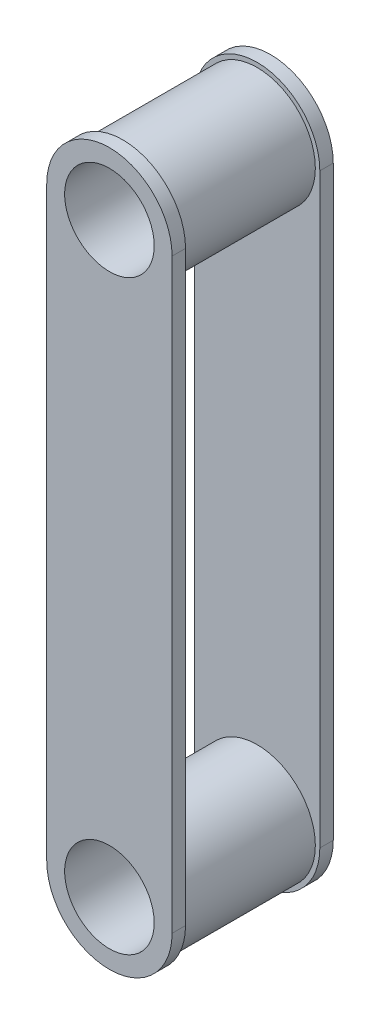
ISO-10303-21;
HEADER;
FILE_DESCRIPTION(('STEP AP214'),'2;1');
FILE_NAME('part.step','',(''),(''),'','','');
FILE_SCHEMA(('AUTOMOTIVE_DESIGN { 1 0 10303 214 1 1 1 1 }'));
ENDSEC;
DATA;
#1=APPLICATION_CONTEXT('core data for automotive mechanical design processes');
#2=APPLICATION_PROTOCOL_DEFINITION('international standard','automotive_design',2000,#1);
#3=PRODUCT_CONTEXT('',#1,'mechanical');
#4=PRODUCT('Part','Part','',(#3));
#5=PRODUCT_RELATED_PRODUCT_CATEGORY('part','',(#4));
#6=PRODUCT_DEFINITION_FORMATION('','',#4);
#7=PRODUCT_DEFINITION_CONTEXT('part definition',#1,'design');
#8=PRODUCT_DEFINITION('design','',#6,#7);
#9=PRODUCT_DEFINITION_SHAPE('','',#8);
#10=(LENGTH_UNIT() NAMED_UNIT(*) SI_UNIT(.MILLI.,.METRE.));
#11=(NAMED_UNIT(*) PLANE_ANGLE_UNIT() SI_UNIT($,.RADIAN.));
#12=(NAMED_UNIT(*) SI_UNIT($,.STERADIAN.) SOLID_ANGLE_UNIT());
#13=UNCERTAINTY_MEASURE_WITH_UNIT(LENGTH_MEASURE(1.E-05),#10,'distance_accuracy_value','');
#14=(GEOMETRIC_REPRESENTATION_CONTEXT(3) GLOBAL_UNCERTAINTY_ASSIGNED_CONTEXT((#13)) GLOBAL_UNIT_ASSIGNED_CONTEXT((#10,
#11,#12)) REPRESENTATION_CONTEXT('',''));
#15=CARTESIAN_POINT('',(0.,0.,0.));
#16=DIRECTION('',(0.,0.,1.));
#17=DIRECTION('',(1.,0.,0.));
#18=AXIS2_PLACEMENT_3D('',#15,#16,#17);
#19=CARTESIAN_POINT('',(-4.40536496171262E-12,655.,89.9999999999981));
#20=DIRECTION('',(0.,0.,-1.));
#21=DIRECTION('',(0.,-1.,0.));
#22=AXIS2_PLACEMENT_3D('',#19,#20,#21);
#23=PLANE('',#22);
#24=CARTESIAN_POINT('',(-4.40536496171262E-12,655.,89.9999999999981));
#25=DIRECTION('',(0.,0.,1.));
#26=DIRECTION('',(-1.,0.,0.));
#27=AXIS2_PLACEMENT_3D('',#24,#25,#26);
#28=CIRCLE('',#27,50.);
#29=CARTESIAN_POINT('',(49.9999999999956,655.,89.9999999999981));
#30=VERTEX_POINT('',#29);
#31=EDGE_CURVE('E27',#30,#30,#28,.T.);
#32=ORIENTED_EDGE('',*,*,#31,.F.);
#33=EDGE_LOOP('',(#32));
#34=FACE_BOUND('',#33,.T.);
#35=CARTESIAN_POINT('',(-3.69482222595252E-12,-4.2632564145606E-13,89.9999999999981));
#36=DIRECTION('',(0.,0.,-1.));
#37=DIRECTION('',(-1.,0.,0.));
#38=AXIS2_PLACEMENT_3D('',#35,#36,#37);
#39=CIRCLE('',#38,50.);
#40=CARTESIAN_POINT('',(49.9999999999963,-2.8421709430404E-13,89.9999999999981));
#41=VERTEX_POINT('',#40);
#42=EDGE_CURVE('E71',#41,#41,#39,.T.);
#43=ORIENTED_EDGE('',*,*,#42,.T.);
#44=EDGE_LOOP('',(#43));
#45=FACE_BOUND('',#44,.T.);
#46=CARTESIAN_POINT('',(-4.40536496171262E-12,655.,89.9999999999981));
#47=DIRECTION('',(0.,0.,-1.));
#48=DIRECTION('',(-1.,0.,0.));
#49=AXIS2_PLACEMENT_3D('',#46,#47,#48);
#50=CIRCLE('',#49,70.);
#51=CARTESIAN_POINT('',(-70.0000000000044,655.,89.9999999999981));
#52=VERTEX_POINT('',#51);
#53=CARTESIAN_POINT('',(69.9999999999956,655.,89.9999999999981));
#54=VERTEX_POINT('',#53);
#55=EDGE_CURVE('E175',#52,#54,#50,.T.);
#56=ORIENTED_EDGE('',*,*,#55,.F.);
#57=DIRECTION('',(0.,-1.,0.));
#58=VECTOR('',#57,1.);
#59=CARTESIAN_POINT('',(-70.0000000000043,585.,89.9999999999981));
#60=LINE('',#59,#58);
#61=CARTESIAN_POINT('',(-70.0000000000037,-5.6843418860808E-13,89.9999999999981));
#62=VERTEX_POINT('',#61);
#63=EDGE_CURVE('E61',#52,#62,#60,.T.);
#64=ORIENTED_EDGE('',*,*,#63,.T.);
#65=CARTESIAN_POINT('',(-3.69482222595252E-12,-4.2632564145606E-13,89.9999999999981));
#66=DIRECTION('',(0.,0.,1.));
#67=DIRECTION('',(-1.,0.,0.));
#68=AXIS2_PLACEMENT_3D('',#65,#66,#67);
#69=CIRCLE('',#68,70.);
#70=CARTESIAN_POINT('',(69.9999999999963,-2.8421709430404E-13,89.9999999999981));
#71=VERTEX_POINT('',#70);
#72=EDGE_CURVE('E200',#62,#71,#69,.T.);
#73=ORIENTED_EDGE('',*,*,#72,.T.);
#74=DIRECTION('',(0.,-1.,0.));
#75=VECTOR('',#74,1.);
#76=CARTESIAN_POINT('',(69.9999999999957,565.,89.9999999999981));
#77=LINE('',#76,#75);
#78=EDGE_CURVE('E222',#54,#71,#77,.T.);
#79=ORIENTED_EDGE('',*,*,#78,.F.);
#80=EDGE_LOOP('',(#56,#64,#73,#79));
#81=FACE_BOUND('',#80,.T.);
#82=ADVANCED_FACE('F16',(#34,#45,#81),#23,.F.);
#83=CARTESIAN_POINT('',(-4.40536496171262E-12,655.,-90.0000000000019));
#84=DIRECTION('',(0.,0.,-1.));
#85=DIRECTION('',(0.,-1.,0.));
#86=AXIS2_PLACEMENT_3D('',#83,#84,#85);
#87=PLANE('',#86);
#88=CARTESIAN_POINT('',(-4.40536496171262E-12,655.,-90.0000000000019));
#89=DIRECTION('',(0.,0.,1.));
#90=DIRECTION('',(-1.,0.,0.));
#91=AXIS2_PLACEMENT_3D('',#88,#89,#90);
#92=CIRCLE('',#91,50.);
#93=CARTESIAN_POINT('',(49.9999999999956,655.,-90.0000000000019));
#94=VERTEX_POINT('',#93);
#95=EDGE_CURVE('E211',#94,#94,#92,.T.);
#96=ORIENTED_EDGE('',*,*,#95,.T.);
#97=EDGE_LOOP('',(#96));
#98=FACE_BOUND('',#97,.T.);
#99=CARTESIAN_POINT('',(-3.69482222595252E-12,-4.2632564145606E-13,-90.0000000000019));
#100=DIRECTION('',(0.,0.,-1.));
#101=DIRECTION('',(-1.,0.,0.));
#102=AXIS2_PLACEMENT_3D('',#99,#100,#101);
#103=CIRCLE('',#102,50.);
#104=CARTESIAN_POINT('',(49.9999999999963,-2.8421709430404E-13,-90.0000000000019));
#105=VERTEX_POINT('',#104);
#106=EDGE_CURVE('E184',#105,#105,#103,.T.);
#107=ORIENTED_EDGE('',*,*,#106,.F.);
#108=EDGE_LOOP('',(#107));
#109=FACE_BOUND('',#108,.T.);
#110=CARTESIAN_POINT('',(-4.40536496171262E-12,655.,-90.0000000000019));
#111=DIRECTION('',(0.,0.,-1.));
#112=DIRECTION('',(-1.,0.,0.));
#113=AXIS2_PLACEMENT_3D('',#110,#111,#112);
#114=CIRCLE('',#113,70.);
#115=CARTESIAN_POINT('',(-70.0000000000044,655.,-90.0000000000019));
#116=VERTEX_POINT('',#115);
#117=CARTESIAN_POINT('',(69.9999999999956,655.,-90.0000000000019));
#118=VERTEX_POINT('',#117);
#119=EDGE_CURVE('E11',#116,#118,#114,.T.);
#120=ORIENTED_EDGE('',*,*,#119,.T.);
#121=DIRECTION('',(0.,-1.,0.));
#122=VECTOR('',#121,1.);
#123=CARTESIAN_POINT('',(69.9999999999956,655.,-90.0000000000019));
#124=LINE('',#123,#122);
#125=CARTESIAN_POINT('',(69.9999999999963,-2.8421709430404E-13,-90.0000000000019));
#126=VERTEX_POINT('',#125);
#127=EDGE_CURVE('E182',#118,#126,#124,.T.);
#128=ORIENTED_EDGE('',*,*,#127,.T.);
#129=CARTESIAN_POINT('',(-3.69482222595252E-12,-4.2632564145606E-13,-90.0000000000019));
#130=DIRECTION('',(0.,0.,1.));
#131=DIRECTION('',(-1.,0.,0.));
#132=AXIS2_PLACEMENT_3D('',#129,#130,#131);
#133=CIRCLE('',#132,70.);
#134=CARTESIAN_POINT('',(-70.0000000000037,-5.6843418860808E-13,-90.0000000000019));
#135=VERTEX_POINT('',#134);
#136=EDGE_CURVE('E148',#135,#126,#133,.T.);
#137=ORIENTED_EDGE('',*,*,#136,.F.);
#138=DIRECTION('',(0.,1.,0.));
#139=VECTOR('',#138,1.);
#140=CARTESIAN_POINT('',(-70.0000000000038,70.,-90.0000000000019));
#141=LINE('',#140,#139);
#142=EDGE_CURVE('E145',#135,#116,#141,.T.);
#143=ORIENTED_EDGE('',*,*,#142,.T.);
#144=EDGE_LOOP('',(#120,#128,#137,#143));
#145=FACE_BOUND('',#144,.T.);
#146=ADVANCED_FACE('F307',(#98,#109,#145),#87,.T.);
#147=CARTESIAN_POINT('',(-4.40536496171262E-12,655.,89.9999999999981));
#148=DIRECTION('',(0.,0.,-1.));
#149=DIRECTION('',(-1.,0.,0.));
#150=AXIS2_PLACEMENT_3D('',#147,#148,#149);
#151=CYLINDRICAL_SURFACE('',#150,70.);
#152=CARTESIAN_POINT('',(-4.40536496171262E-12,655.,-75.0000000000019));
#153=DIRECTION('',(0.,0.,-1.));
#154=DIRECTION('',(-1.,0.,0.));
#155=AXIS2_PLACEMENT_3D('',#152,#153,#154);
#156=CIRCLE('',#155,70.);
#157=CARTESIAN_POINT('',(-70.0000000000044,655.,-75.0000000000019));
#158=VERTEX_POINT('',#157);
#159=CARTESIAN_POINT('',(69.9999999999956,655.,-75.0000000000019));
#160=VERTEX_POINT('',#159);
#161=EDGE_CURVE('E161',#158,#160,#156,.T.);
#162=ORIENTED_EDGE('',*,*,#161,.T.);
#163=DIRECTION('',(0.,0.,-1.));
#164=VECTOR('',#163,1.);
#165=CARTESIAN_POINT('',(69.9999999999956,655.,89.9999999999981));
#166=LINE('',#165,#164);
#167=EDGE_CURVE('E177',#160,#118,#166,.T.);
#168=ORIENTED_EDGE('',*,*,#167,.T.);
#169=ORIENTED_EDGE('',*,*,#119,.F.);
#170=DIRECTION('',(0.,0.,-1.));
#171=VECTOR('',#170,1.);
#172=CARTESIAN_POINT('',(-70.0000000000044,655.,89.9999999999981));
#173=LINE('',#172,#171);
#174=EDGE_CURVE('E185',#158,#116,#173,.T.);
#175=ORIENTED_EDGE('',*,*,#174,.F.);
#176=EDGE_LOOP('',(#162,#168,#169,#175));
#177=FACE_BOUND('',#176,.T.);
#178=ADVANCED_FACE('F310',(#177),#151,.T.);
#179=CARTESIAN_POINT('',(-4.40536496171262E-12,655.,89.9999999999981));
#180=DIRECTION('',(0.,0.,-1.));
#181=DIRECTION('',(-1.,0.,0.));
#182=AXIS2_PLACEMENT_3D('',#179,#180,#181);
#183=CYLINDRICAL_SURFACE('',#182,50.);
#184=ORIENTED_EDGE('',*,*,#95,.F.);
#185=DIRECTION('',(0.,0.,1.));
#186=VECTOR('',#185,1.);
#187=CARTESIAN_POINT('',(49.9999999999956,655.,89.9999999999981));
#188=LINE('',#187,#186);
#189=EDGE_CURVE('E215',#94,#30,#188,.T.);
#190=ORIENTED_EDGE('',*,*,#189,.T.);
#191=ORIENTED_EDGE('',*,*,#31,.T.);
#192=ORIENTED_EDGE('',*,*,#189,.F.);
#193=EDGE_LOOP('',(#184,#190,#191,#192));
#194=FACE_BOUND('',#193,.T.);
#195=ADVANCED_FACE('F340',(#194),#183,.F.);
#196=CARTESIAN_POINT('',(-70.0000000000044,655.,-90.0000000000019));
#197=DIRECTION('',(-1.,0.,0.));
#198=DIRECTION('',(0.,1.,0.));
#199=AXIS2_PLACEMENT_3D('',#196,#197,#198);
#200=PLANE('',#199);
#201=DIRECTION('',(0.,-1.,0.));
#202=VECTOR('',#201,1.);
#203=CARTESIAN_POINT('',(-70.0000000000044,655.,74.9999999999981));
#204=LINE('',#203,#202);
#205=CARTESIAN_POINT('',(-70.0000000000044,655.,74.9999999999981));
#206=VERTEX_POINT('',#205);
#207=CARTESIAN_POINT('',(-70.0000000000037,-5.6843418860808E-13,74.9999999999981));
#208=VERTEX_POINT('',#207);
#209=EDGE_CURVE('E149',#206,#208,#204,.T.);
#210=ORIENTED_EDGE('',*,*,#209,.T.);
#211=DIRECTION('',(0.,0.,-1.));
#212=VECTOR('',#211,1.);
#213=CARTESIAN_POINT('',(-70.0000000000037,-5.6843418860808E-13,89.9999999999981));
#214=LINE('',#213,#212);
#215=EDGE_CURVE('E208',#62,#208,#214,.T.);
#216=ORIENTED_EDGE('',*,*,#215,.F.);
#217=ORIENTED_EDGE('',*,*,#63,.F.);
#218=DIRECTION('',(0.,0.,-1.));
#219=VECTOR('',#218,1.);
#220=CARTESIAN_POINT('',(-70.0000000000044,655.,89.9999999999981));
#221=LINE('',#220,#219);
#222=EDGE_CURVE('E172',#52,#206,#221,.T.);
#223=ORIENTED_EDGE('',*,*,#222,.T.);
#224=EDGE_LOOP('',(#210,#216,#217,#223));
#225=FACE_BOUND('',#224,.T.);
#226=ADVANCED_FACE('F293',(#225),#200,.T.);
#227=CARTESIAN_POINT('',(-3.69482222595252E-12,-4.2632564145606E-13,89.9999999999981));
#228=DIRECTION('',(0.,0.,1.));
#229=DIRECTION('',(-1.,0.,0.));
#230=AXIS2_PLACEMENT_3D('',#227,#228,#229);
#231=CYLINDRICAL_SURFACE('',#230,70.);
#232=CARTESIAN_POINT('',(-3.69482222595252E-12,-4.2632564145606E-13,74.9999999999981));
#233=DIRECTION('',(0.,0.,1.));
#234=DIRECTION('',(-1.,0.,0.));
#235=AXIS2_PLACEMENT_3D('',#232,#233,#234);
#236=CIRCLE('',#235,70.);
#237=CARTESIAN_POINT('',(69.9999999999963,-2.8421709430404E-13,74.9999999999981));
#238=VERTEX_POINT('',#237);
#239=EDGE_CURVE('E238',#208,#238,#236,.T.);
#240=ORIENTED_EDGE('',*,*,#239,.T.);
#241=DIRECTION('',(0.,0.,-1.));
#242=VECTOR('',#241,1.);
#243=CARTESIAN_POINT('',(69.9999999999963,-2.8421709430404E-13,89.9999999999981));
#244=LINE('',#243,#242);
#245=EDGE_CURVE('E176',#71,#238,#244,.T.);
#246=ORIENTED_EDGE('',*,*,#245,.F.);
#247=ORIENTED_EDGE('',*,*,#72,.F.);
#248=ORIENTED_EDGE('',*,*,#215,.T.);
#249=EDGE_LOOP('',(#240,#246,#247,#248));
#250=FACE_BOUND('',#249,.T.);
#251=ADVANCED_FACE('F296',(#250),#231,.T.);
#252=CARTESIAN_POINT('',(-3.69482222595252E-12,-4.2632564145606E-13,89.9999999999981));
#253=DIRECTION('',(0.,0.,1.));
#254=DIRECTION('',(-1.,0.,0.));
#255=AXIS2_PLACEMENT_3D('',#252,#253,#254);
#256=CYLINDRICAL_SURFACE('',#255,50.);
#257=ORIENTED_EDGE('',*,*,#106,.T.);
#258=DIRECTION('',(0.,0.,1.));
#259=VECTOR('',#258,1.);
#260=CARTESIAN_POINT('',(49.9999999999963,-3.30058741119386E-13,89.9999999999981));
#261=LINE('',#260,#259);
#262=EDGE_CURVE('E191',#105,#41,#261,.T.);
#263=ORIENTED_EDGE('',*,*,#262,.T.);
#264=ORIENTED_EDGE('',*,*,#42,.F.);
#265=ORIENTED_EDGE('',*,*,#262,.F.);
#266=EDGE_LOOP('',(#257,#263,#264,#265));
#267=FACE_BOUND('',#266,.T.);
#268=ADVANCED_FACE('F449',(#267),#256,.F.);
#269=CARTESIAN_POINT('',(-70.0000000000044,655.,-90.0000000000019));
#270=DIRECTION('',(-1.,0.,0.));
#271=DIRECTION('',(0.,1.,0.));
#272=AXIS2_PLACEMENT_3D('',#269,#270,#271);
#273=PLANE('',#272);
#274=DIRECTION('',(0.,1.,0.));
#275=VECTOR('',#274,1.);
#276=CARTESIAN_POINT('',(-70.0000000000044,655.,-75.0000000000019));
#277=LINE('',#276,#275);
#278=CARTESIAN_POINT('',(-70.0000000000037,-5.6843418860808E-13,-75.0000000000019));
#279=VERTEX_POINT('',#278);
#280=EDGE_CURVE('E142',#279,#158,#277,.T.);
#281=ORIENTED_EDGE('',*,*,#280,.T.);
#282=ORIENTED_EDGE('',*,*,#174,.T.);
#283=ORIENTED_EDGE('',*,*,#142,.F.);
#284=DIRECTION('',(0.,0.,-1.));
#285=VECTOR('',#284,1.);
#286=CARTESIAN_POINT('',(-70.0000000000037,-5.6843418860808E-13,89.9999999999981));
#287=LINE('',#286,#285);
#288=EDGE_CURVE('E138',#279,#135,#287,.T.);
#289=ORIENTED_EDGE('',*,*,#288,.F.);
#290=EDGE_LOOP('',(#281,#282,#283,#289));
#291=FACE_BOUND('',#290,.T.);
#292=ADVANCED_FACE('F139',(#291),#273,.T.);
#293=CARTESIAN_POINT('',(-4.40536496171262E-12,655.,89.9999999999981));
#294=DIRECTION('',(0.,0.,-1.));
#295=DIRECTION('',(-1.,0.,0.));
#296=AXIS2_PLACEMENT_3D('',#293,#294,#295);
#297=CYLINDRICAL_SURFACE('',#296,70.);
#298=CARTESIAN_POINT('',(-4.40536496171262E-12,655.,74.9999999999981));
#299=DIRECTION('',(0.,0.,1.));
#300=DIRECTION('',(-1.,0.,0.));
#301=AXIS2_PLACEMENT_3D('',#298,#299,#300);
#302=CIRCLE('',#301,70.);
#303=CARTESIAN_POINT('',(69.9999999999956,655.,74.9999999999981));
#304=VERTEX_POINT('',#303);
#305=EDGE_CURVE('E189',#304,#206,#302,.T.);
#306=ORIENTED_EDGE('',*,*,#305,.T.);
#307=ORIENTED_EDGE('',*,*,#222,.F.);
#308=ORIENTED_EDGE('',*,*,#55,.T.);
#309=DIRECTION('',(0.,0.,-1.));
#310=VECTOR('',#309,1.);
#311=CARTESIAN_POINT('',(69.9999999999956,655.,89.9999999999981));
#312=LINE('',#311,#310);
#313=EDGE_CURVE('E181',#54,#304,#312,.T.);
#314=ORIENTED_EDGE('',*,*,#313,.T.);
#315=EDGE_LOOP('',(#306,#307,#308,#314));
#316=FACE_BOUND('',#315,.T.);
#317=ADVANCED_FACE('F275',(#316),#297,.T.);
#318=CARTESIAN_POINT('',(69.9999999999957,565.,-90.0000000000019));
#319=DIRECTION('',(1.,0.,0.));
#320=DIRECTION('',(0.,1.,0.));
#321=AXIS2_PLACEMENT_3D('',#318,#319,#320);
#322=PLANE('',#321);
#323=DIRECTION('',(0.,1.,0.));
#324=VECTOR('',#323,1.);
#325=CARTESIAN_POINT('',(69.9999999999957,610.,74.9999999999981));
#326=LINE('',#325,#324);
#327=EDGE_CURVE('E218',#238,#304,#326,.T.);
#328=ORIENTED_EDGE('',*,*,#327,.T.);
#329=ORIENTED_EDGE('',*,*,#313,.F.);
#330=ORIENTED_EDGE('',*,*,#78,.T.);
#331=ORIENTED_EDGE('',*,*,#245,.T.);
#332=EDGE_LOOP('',(#328,#329,#330,#331));
#333=FACE_BOUND('',#332,.T.);
#334=ADVANCED_FACE('F18',(#333),#322,.T.);
#335=CARTESIAN_POINT('',(69.9999999999957,565.,-90.0000000000019));
#336=DIRECTION('',(1.,0.,0.));
#337=DIRECTION('',(0.,1.,0.));
#338=AXIS2_PLACEMENT_3D('',#335,#336,#337);
#339=PLANE('',#338);
#340=DIRECTION('',(0.,-1.,0.));
#341=VECTOR('',#340,1.);
#342=CARTESIAN_POINT('',(69.9999999999957,610.,-75.0000000000019));
#343=LINE('',#342,#341);
#344=CARTESIAN_POINT('',(69.9999999999963,-2.8421709430404E-13,-75.0000000000019));
#345=VERTEX_POINT('',#344);
#346=EDGE_CURVE('E157',#160,#345,#343,.T.);
#347=ORIENTED_EDGE('',*,*,#346,.T.);
#348=DIRECTION('',(0.,0.,-1.));
#349=VECTOR('',#348,1.);
#350=CARTESIAN_POINT('',(69.9999999999963,-2.8421709430404E-13,89.9999999999981));
#351=LINE('',#350,#349);
#352=EDGE_CURVE('E130',#345,#126,#351,.T.);
#353=ORIENTED_EDGE('',*,*,#352,.T.);
#354=ORIENTED_EDGE('',*,*,#127,.F.);
#355=ORIENTED_EDGE('',*,*,#167,.F.);
#356=EDGE_LOOP('',(#347,#353,#354,#355));
#357=FACE_BOUND('',#356,.T.);
#358=ADVANCED_FACE('F312',(#357),#339,.T.);
#359=CARTESIAN_POINT('',(-3.69482222595252E-12,-4.2632564145606E-13,89.9999999999981));
#360=DIRECTION('',(0.,0.,1.));
#361=DIRECTION('',(-1.,0.,0.));
#362=AXIS2_PLACEMENT_3D('',#359,#360,#361);
#363=CYLINDRICAL_SURFACE('',#362,70.);
#364=CARTESIAN_POINT('',(-3.69482222595252E-12,-4.2632564145606E-13,-75.0000000000019));
#365=DIRECTION('',(0.,0.,-1.));
#366=DIRECTION('',(-1.,0.,0.));
#367=AXIS2_PLACEMENT_3D('',#364,#365,#366);
#368=CIRCLE('',#367,70.);
#369=EDGE_CURVE('E152',#345,#279,#368,.T.);
#370=ORIENTED_EDGE('',*,*,#369,.T.);
#371=ORIENTED_EDGE('',*,*,#288,.T.);
#372=ORIENTED_EDGE('',*,*,#136,.T.);
#373=ORIENTED_EDGE('',*,*,#352,.F.);
#374=EDGE_LOOP('',(#370,#371,#372,#373));
#375=FACE_BOUND('',#374,.T.);
#376=ADVANCED_FACE('F153',(#375),#363,.T.);
#377=CARTESIAN_POINT('',(-4.40536496171262E-12,655.,74.9999999999981));
#378=DIRECTION('',(0.,0.,-1.));
#379=DIRECTION('',(0.,-1.,0.));
#380=AXIS2_PLACEMENT_3D('',#377,#378,#379);
#381=PLANE('',#380);
#382=CARTESIAN_POINT('',(-4.40536496171262E-12,655.,74.9999999999981));
#383=DIRECTION('',(0.,0.,1.));
#384=DIRECTION('',(-1.,0.,0.));
#385=AXIS2_PLACEMENT_3D('',#382,#383,#384);
#386=CIRCLE('',#385,65.);
#387=CARTESIAN_POINT('',(64.9999999999956,655.,74.9999999999981));
#388=VERTEX_POINT('',#387);
#389=EDGE_CURVE('E255',#388,#388,#386,.T.);
#390=ORIENTED_EDGE('',*,*,#389,.T.);
#391=EDGE_LOOP('',(#390));
#392=FACE_BOUND('',#391,.T.);
#393=CARTESIAN_POINT('',(-3.69482222595252E-12,-4.2632564145606E-13,74.9999999999981));
#394=DIRECTION('',(0.,0.,-1.));
#395=DIRECTION('',(-1.,0.,0.));
#396=AXIS2_PLACEMENT_3D('',#393,#394,#395);
#397=CIRCLE('',#396,65.);
#398=CARTESIAN_POINT('',(64.9999999999963,-2.8421709430404E-13,74.9999999999981));
#399=VERTEX_POINT('',#398);
#400=EDGE_CURVE('E20',#399,#399,#397,.T.);
#401=ORIENTED_EDGE('',*,*,#400,.F.);
#402=EDGE_LOOP('',(#401));
#403=FACE_BOUND('',#402,.T.);
#404=ORIENTED_EDGE('',*,*,#305,.F.);
#405=ORIENTED_EDGE('',*,*,#327,.F.);
#406=ORIENTED_EDGE('',*,*,#239,.F.);
#407=ORIENTED_EDGE('',*,*,#209,.F.);
#408=EDGE_LOOP('',(#404,#405,#406,#407));
#409=FACE_BOUND('',#408,.T.);
#410=ADVANCED_FACE('F262',(#392,#403,#409),#381,.T.);
#411=CARTESIAN_POINT('',(-4.40536496171262E-12,655.,-75.0000000000019));
#412=DIRECTION('',(0.,0.,-1.));
#413=DIRECTION('',(0.,-1.,0.));
#414=AXIS2_PLACEMENT_3D('',#411,#412,#413);
#415=PLANE('',#414);
#416=CARTESIAN_POINT('',(-4.40536496171262E-12,655.,-75.0000000000019));
#417=DIRECTION('',(0.,0.,1.));
#418=DIRECTION('',(-1.,0.,0.));
#419=AXIS2_PLACEMENT_3D('',#416,#417,#418);
#420=CIRCLE('',#419,65.);
#421=CARTESIAN_POINT('',(64.9999999999956,655.,-75.0000000000019));
#422=VERTEX_POINT('',#421);
#423=EDGE_CURVE('E168',#422,#422,#420,.T.);
#424=ORIENTED_EDGE('',*,*,#423,.F.);
#425=EDGE_LOOP('',(#424));
#426=FACE_BOUND('',#425,.T.);
#427=CARTESIAN_POINT('',(-3.69482222595252E-12,-4.2632564145606E-13,-75.0000000000019));
#428=DIRECTION('',(0.,0.,-1.));
#429=DIRECTION('',(-1.,0.,0.));
#430=AXIS2_PLACEMENT_3D('',#427,#428,#429);
#431=CIRCLE('',#430,65.);
#432=CARTESIAN_POINT('',(64.9999999999963,-2.8421709430404E-13,-75.0000000000019));
#433=VERTEX_POINT('',#432);
#434=EDGE_CURVE('E247',#433,#433,#431,.T.);
#435=ORIENTED_EDGE('',*,*,#434,.T.);
#436=EDGE_LOOP('',(#435));
#437=FACE_BOUND('',#436,.T.);
#438=ORIENTED_EDGE('',*,*,#161,.F.);
#439=ORIENTED_EDGE('',*,*,#280,.F.);
#440=ORIENTED_EDGE('',*,*,#369,.F.);
#441=ORIENTED_EDGE('',*,*,#346,.F.);
#442=EDGE_LOOP('',(#438,#439,#440,#441));
#443=FACE_BOUND('',#442,.T.);
#444=ADVANCED_FACE('F159',(#426,#437,#443),#415,.F.);
#445=CARTESIAN_POINT('',(-4.40536496171262E-12,655.,89.9999999999981));
#446=DIRECTION('',(0.,0.,-1.));
#447=DIRECTION('',(-1.,0.,0.));
#448=AXIS2_PLACEMENT_3D('',#445,#446,#447);
#449=CYLINDRICAL_SURFACE('',#448,65.);
#450=ORIENTED_EDGE('',*,*,#389,.F.);
#451=DIRECTION('',(0.,0.,-1.));
#452=VECTOR('',#451,1.);
#453=CARTESIAN_POINT('',(64.9999999999956,655.,89.9999999999981));
#454=LINE('',#453,#452);
#455=EDGE_CURVE('E551',#388,#422,#454,.T.);
#456=ORIENTED_EDGE('',*,*,#455,.T.);
#457=ORIENTED_EDGE('',*,*,#423,.T.);
#458=ORIENTED_EDGE('',*,*,#455,.F.);
#459=EDGE_LOOP('',(#450,#456,#457,#458));
#460=FACE_BOUND('',#459,.T.);
#461=ADVANCED_FACE('F334',(#460),#449,.T.);
#462=CARTESIAN_POINT('',(-3.69482222595252E-12,-4.2632564145606E-13,89.9999999999981));
#463=DIRECTION('',(0.,0.,1.));
#464=DIRECTION('',(-1.,0.,0.));
#465=AXIS2_PLACEMENT_3D('',#462,#463,#464);
#466=CYLINDRICAL_SURFACE('',#465,65.);
#467=ORIENTED_EDGE('',*,*,#400,.T.);
#468=DIRECTION('',(0.,0.,-1.));
#469=VECTOR('',#468,1.);
#470=CARTESIAN_POINT('',(64.9999999999963,-3.01178671018383E-13,89.9999999999981));
#471=LINE('',#470,#469);
#472=EDGE_CURVE('E244',#399,#433,#471,.T.);
#473=ORIENTED_EDGE('',*,*,#472,.T.);
#474=ORIENTED_EDGE('',*,*,#434,.F.);
#475=ORIENTED_EDGE('',*,*,#472,.F.);
#476=EDGE_LOOP('',(#467,#473,#474,#475));
#477=FACE_BOUND('',#476,.T.);
#478=ADVANCED_FACE('F260',(#477),#466,.T.);
#479=CLOSED_SHELL('',(#82,#146,#178,#195,#226,#251,#268,#292,#317,#334,#358,#376,#410,#444,#461,#478));
#480=MANIFOLD_SOLID_BREP('B1',#479);
#481=ADVANCED_BREP_SHAPE_REPRESENTATION('',(#18,#480),#14);
#482=SHAPE_DEFINITION_REPRESENTATION(#9,#481);
ENDSEC;
END-ISO-10303-21;
